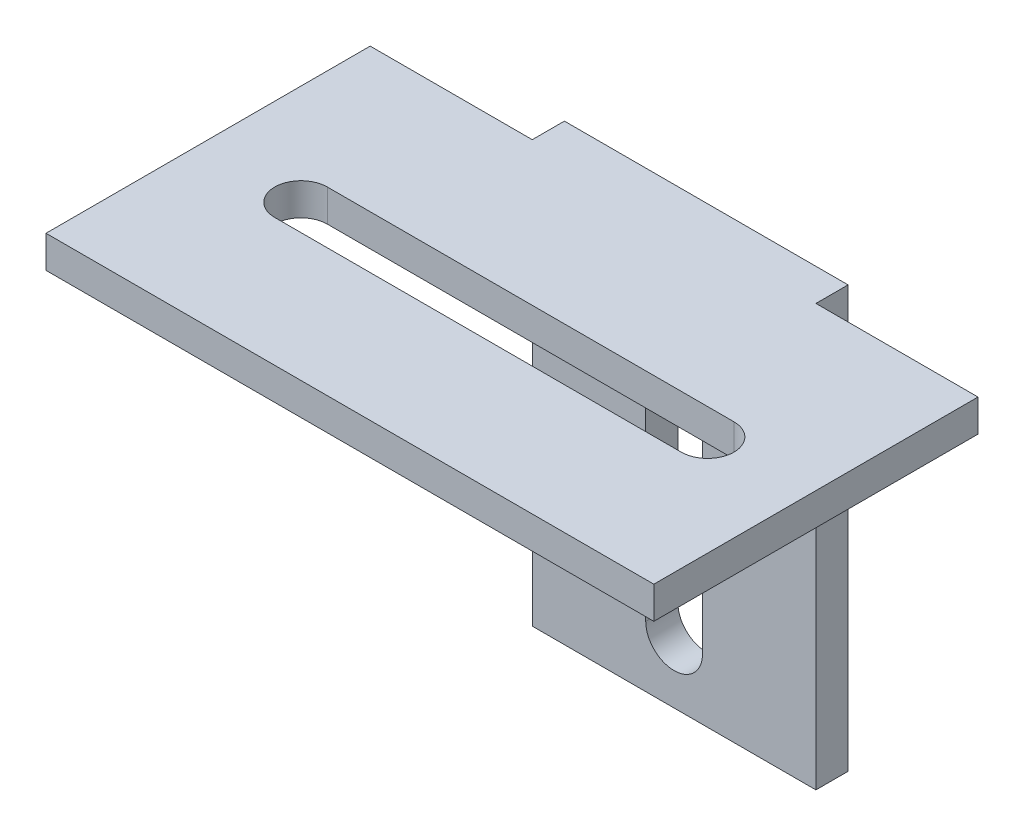
ISO-10303-21;
HEADER;
FILE_DESCRIPTION(('STEP AP214'),'2;1');
FILE_NAME('part.step','',(''),(''),'','','');
FILE_SCHEMA(('AUTOMOTIVE_DESIGN { 1 0 10303 214 1 1 1 1 }'));
ENDSEC;
DATA;
#1=APPLICATION_CONTEXT('core data for automotive mechanical design processes');
#2=APPLICATION_PROTOCOL_DEFINITION('international standard','automotive_design',2000,#1);
#3=PRODUCT_CONTEXT('',#1,'mechanical');
#4=PRODUCT('Part','Part','',(#3));
#5=PRODUCT_RELATED_PRODUCT_CATEGORY('part','',(#4));
#6=PRODUCT_DEFINITION_FORMATION('','',#4);
#7=PRODUCT_DEFINITION_CONTEXT('part definition',#1,'design');
#8=PRODUCT_DEFINITION('design','',#6,#7);
#9=PRODUCT_DEFINITION_SHAPE('','',#8);
#10=(LENGTH_UNIT() NAMED_UNIT(*) SI_UNIT(.MILLI.,.METRE.));
#11=(NAMED_UNIT(*) PLANE_ANGLE_UNIT() SI_UNIT($,.RADIAN.));
#12=(NAMED_UNIT(*) SI_UNIT($,.STERADIAN.) SOLID_ANGLE_UNIT());
#13=UNCERTAINTY_MEASURE_WITH_UNIT(LENGTH_MEASURE(1.E-05),#10,'distance_accuracy_value','');
#14=(GEOMETRIC_REPRESENTATION_CONTEXT(3) GLOBAL_UNCERTAINTY_ASSIGNED_CONTEXT((#13)) GLOBAL_UNIT_ASSIGNED_CONTEXT((#10,
#11,#12)) REPRESENTATION_CONTEXT('',''));
#15=CARTESIAN_POINT('',(0.,0.,0.));
#16=DIRECTION('',(0.,0.,1.));
#17=DIRECTION('',(1.,0.,0.));
#18=AXIS2_PLACEMENT_3D('',#15,#16,#17);
#19=CARTESIAN_POINT('',(0.,104.,24.1375));
#20=DIRECTION('',(0.,0.,1.));
#21=DIRECTION('',(1.,0.,0.));
#22=AXIS2_PLACEMENT_3D('',#19,#20,#21);
#23=PLANE('',#22);
#24=DIRECTION('',(0.,-1.,0.));
#25=VECTOR('',#24,1.);
#26=CARTESIAN_POINT('',(35.,0.,24.1375));
#27=LINE('',#26,#25);
#28=CARTESIAN_POINT('',(35.,7.93750000000002,24.1375));
#29=VERTEX_POINT('',#28);
#30=CARTESIAN_POINT('',(35.,0.,24.1375));
#31=VERTEX_POINT('',#30);
#32=EDGE_CURVE('E65',#29,#31,#27,.T.);
#33=ORIENTED_EDGE('',*,*,#32,.F.);
#34=DIRECTION('',(1.,0.,0.));
#35=VECTOR('',#34,1.);
#36=CARTESIAN_POINT('',(0.,7.93750000000001,24.1375));
#37=LINE('',#36,#35);
#38=CARTESIAN_POINT('',(75.,7.93750000000003,24.1375));
#39=VERTEX_POINT('',#38);
#40=EDGE_CURVE('E51',#29,#39,#37,.T.);
#41=ORIENTED_EDGE('',*,*,#40,.T.);
#42=DIRECTION('',(0.,-1.,0.));
#43=VECTOR('',#42,1.);
#44=CARTESIAN_POINT('',(75.,0.,24.1375));
#45=LINE('',#44,#43);
#46=CARTESIAN_POINT('',(75.,0.,24.1375));
#47=VERTEX_POINT('',#46);
#48=EDGE_CURVE('E237',#39,#47,#45,.T.);
#49=ORIENTED_EDGE('',*,*,#48,.T.);
#50=DIRECTION('',(1.,0.,0.));
#51=VECTOR('',#50,1.);
#52=CARTESIAN_POINT('',(0.,0.,24.1375));
#53=LINE('',#52,#51);
#54=EDGE_CURVE('E240',#31,#47,#53,.T.);
#55=ORIENTED_EDGE('',*,*,#54,.F.);
#56=EDGE_LOOP('',(#33,#41,#49,#55));
#57=FACE_BOUND('',#56,.T.);
#58=ADVANCED_FACE('F43',(#57),#23,.F.);
#59=CARTESIAN_POINT('',(-50.168497939826,0.,72.5375));
#60=DIRECTION('',(0.,0.,-1.));
#61=DIRECTION('',(-1.,0.,0.));
#62=AXIS2_PLACEMENT_3D('',#59,#60,#61);
#63=PLANE('',#62);
#64=DIRECTION('',(0.,-1.,0.));
#65=VECTOR('',#64,1.);
#66=CARTESIAN_POINT('',(-50.168497939826,0.,72.5375));
#67=LINE('',#66,#65);
#68=CARTESIAN_POINT('',(-50.168497939826,7.93750000000001,72.5375));
#69=VERTEX_POINT('',#68);
#70=CARTESIAN_POINT('',(-50.168497939826,0.,72.5375));
#71=VERTEX_POINT('',#70);
#72=EDGE_CURVE('E295',#69,#71,#67,.T.);
#73=ORIENTED_EDGE('',*,*,#72,.F.);
#74=DIRECTION('',(-1.,0.,0.));
#75=VECTOR('',#74,1.);
#76=CARTESIAN_POINT('',(0.,7.93750000000001,72.5375));
#77=LINE('',#76,#75);
#78=CARTESIAN_POINT('',(50.168497939826,7.93750000000002,72.5375));
#79=VERTEX_POINT('',#78);
#80=EDGE_CURVE('E282',#79,#69,#77,.T.);
#81=ORIENTED_EDGE('',*,*,#80,.F.);
#82=DIRECTION('',(0.,-1.,0.));
#83=VECTOR('',#82,1.);
#84=CARTESIAN_POINT('',(50.168497939826,0.,72.5375));
#85=LINE('',#84,#83);
#86=CARTESIAN_POINT('',(50.168497939826,0.,72.5375));
#87=VERTEX_POINT('',#86);
#88=EDGE_CURVE('E293',#79,#87,#85,.T.);
#89=ORIENTED_EDGE('',*,*,#88,.T.);
#90=DIRECTION('',(-1.,0.,0.));
#91=VECTOR('',#90,1.);
#92=CARTESIAN_POINT('',(-50.168497939826,0.,72.5375));
#93=LINE('',#92,#91);
#94=EDGE_CURVE('E261',#87,#71,#93,.T.);
#95=ORIENTED_EDGE('',*,*,#94,.T.);
#96=EDGE_LOOP('',(#73,#81,#89,#95));
#97=FACE_BOUND('',#96,.T.);
#98=ADVANCED_FACE('F309',(#97),#63,.T.);
#99=CARTESIAN_POINT('',(50.168497939826,0.,66.0375));
#100=DIRECTION('',(0.,-1.,0.));
#101=DIRECTION('',(1.,0.,0.));
#102=AXIS2_PLACEMENT_3D('',#99,#100,#101);
#103=CYLINDRICAL_SURFACE('',#102,6.49999999999999);
#104=ORIENTED_EDGE('',*,*,#88,.F.);
#105=CARTESIAN_POINT('',(50.168497939826,7.93750000000001,66.0375));
#106=DIRECTION('',(0.,-1.,0.));
#107=DIRECTION('',(1.,0.,0.));
#108=AXIS2_PLACEMENT_3D('',#105,#106,#107);
#109=CIRCLE('',#108,6.49999999999999);
#110=CARTESIAN_POINT('',(50.168497939826,7.93750000000002,59.5375));
#111=VERTEX_POINT('',#110);
#112=EDGE_CURVE('E249',#111,#79,#109,.T.);
#113=ORIENTED_EDGE('',*,*,#112,.F.);
#114=DIRECTION('',(0.,-1.,0.));
#115=VECTOR('',#114,1.);
#116=CARTESIAN_POINT('',(50.168497939826,0.,59.5375));
#117=LINE('',#116,#115);
#118=CARTESIAN_POINT('',(50.168497939826,0.,59.5375));
#119=VERTEX_POINT('',#118);
#120=EDGE_CURVE('E291',#111,#119,#117,.T.);
#121=ORIENTED_EDGE('',*,*,#120,.T.);
#122=CARTESIAN_POINT('',(50.168497939826,0.,66.0375));
#123=DIRECTION('',(0.,-1.,0.));
#124=DIRECTION('',(1.,0.,0.));
#125=AXIS2_PLACEMENT_3D('',#122,#123,#124);
#126=CIRCLE('',#125,6.49999999999999);
#127=EDGE_CURVE('E264',#119,#87,#126,.T.);
#128=ORIENTED_EDGE('',*,*,#127,.T.);
#129=EDGE_LOOP('',(#104,#113,#121,#128));
#130=FACE_BOUND('',#129,.T.);
#131=ADVANCED_FACE('F314',(#130),#103,.F.);
#132=CARTESIAN_POINT('',(-50.168497939826,0.,59.5375));
#133=DIRECTION('',(0.,0.,1.));
#134=DIRECTION('',(1.,0.,0.));
#135=AXIS2_PLACEMENT_3D('',#132,#133,#134);
#136=PLANE('',#135);
#137=ORIENTED_EDGE('',*,*,#120,.F.);
#138=DIRECTION('',(-1.,0.,0.));
#139=VECTOR('',#138,1.);
#140=CARTESIAN_POINT('',(0.,7.93750000000001,59.5375));
#141=LINE('',#140,#139);
#142=CARTESIAN_POINT('',(-50.168497939826,7.93750000000001,59.5375));
#143=VERTEX_POINT('',#142);
#144=EDGE_CURVE('E271',#143,#111,#141,.F.);
#145=ORIENTED_EDGE('',*,*,#144,.F.);
#146=DIRECTION('',(0.,-1.,0.));
#147=VECTOR('',#146,1.);
#148=CARTESIAN_POINT('',(-50.168497939826,0.,59.5375));
#149=LINE('',#148,#147);
#150=CARTESIAN_POINT('',(-50.168497939826,0.,59.5375));
#151=VERTEX_POINT('',#150);
#152=EDGE_CURVE('E290',#143,#151,#149,.T.);
#153=ORIENTED_EDGE('',*,*,#152,.T.);
#154=DIRECTION('',(1.,0.,0.));
#155=VECTOR('',#154,1.);
#156=CARTESIAN_POINT('',(-50.168497939826,0.,59.5375));
#157=LINE('',#156,#155);
#158=EDGE_CURVE('E255',#151,#119,#157,.T.);
#159=ORIENTED_EDGE('',*,*,#158,.T.);
#160=EDGE_LOOP('',(#137,#145,#153,#159));
#161=FACE_BOUND('',#160,.T.);
#162=ADVANCED_FACE('F299',(#161),#136,.T.);
#163=CARTESIAN_POINT('',(75.,0.,7.9375));
#164=DIRECTION('',(1.,0.,0.));
#165=DIRECTION('',(0.,0.,-1.));
#166=AXIS2_PLACEMENT_3D('',#163,#164,#165);
#167=PLANE('',#166);
#168=ORIENTED_EDGE('',*,*,#48,.F.);
#169=DIRECTION('',(0.,0.,1.));
#170=VECTOR('',#169,1.);
#171=CARTESIAN_POINT('',(75.,7.93750000000003,7.9375));
#172=LINE('',#171,#170);
#173=CARTESIAN_POINT('',(75.,7.93750000000003,104.1375));
#174=VERTEX_POINT('',#173);
#175=EDGE_CURVE('E243',#174,#39,#172,.F.);
#176=ORIENTED_EDGE('',*,*,#175,.F.);
#177=DIRECTION('',(0.,-1.,0.));
#178=VECTOR('',#177,1.);
#179=CARTESIAN_POINT('',(75.,0.,104.1375));
#180=LINE('',#179,#178);
#181=CARTESIAN_POINT('',(75.,0.,104.1375));
#182=VERTEX_POINT('',#181);
#183=EDGE_CURVE('E288',#174,#182,#180,.T.);
#184=ORIENTED_EDGE('',*,*,#183,.T.);
#185=DIRECTION('',(0.,0.,-1.));
#186=VECTOR('',#185,1.);
#187=CARTESIAN_POINT('',(75.,0.,7.9375));
#188=LINE('',#187,#186);
#189=EDGE_CURVE('E245',#182,#47,#188,.T.);
#190=ORIENTED_EDGE('',*,*,#189,.T.);
#191=EDGE_LOOP('',(#168,#176,#184,#190));
#192=FACE_BOUND('',#191,.T.);
#193=ADVANCED_FACE('F321',(#192),#167,.T.);
#194=CARTESIAN_POINT('',(-75.,0.,104.1375));
#195=DIRECTION('',(0.,0.,-1.));
#196=DIRECTION('',(-1.,0.,0.));
#197=AXIS2_PLACEMENT_3D('',#194,#195,#196);
#198=PLANE('',#197);
#199=ORIENTED_EDGE('',*,*,#183,.F.);
#200=DIRECTION('',(-1.,0.,0.));
#201=VECTOR('',#200,1.);
#202=CARTESIAN_POINT('',(0.,7.93750000000001,104.1375));
#203=LINE('',#202,#201);
#204=CARTESIAN_POINT('',(-75.,7.9375,104.1375));
#205=VERTEX_POINT('',#204);
#206=EDGE_CURVE('E272',#174,#205,#203,.T.);
#207=ORIENTED_EDGE('',*,*,#206,.T.);
#208=DIRECTION('',(0.,-1.,0.));
#209=VECTOR('',#208,1.);
#210=CARTESIAN_POINT('',(-75.,0.,104.1375));
#211=LINE('',#210,#209);
#212=CARTESIAN_POINT('',(-75.,0.,104.1375));
#213=VERTEX_POINT('',#212);
#214=EDGE_CURVE('E267',#205,#213,#211,.T.);
#215=ORIENTED_EDGE('',*,*,#214,.T.);
#216=DIRECTION('',(-1.,0.,0.));
#217=VECTOR('',#216,1.);
#218=CARTESIAN_POINT('',(-75.,0.,104.1375));
#219=LINE('',#218,#217);
#220=EDGE_CURVE('E248',#182,#213,#219,.T.);
#221=ORIENTED_EDGE('',*,*,#220,.F.);
#222=EDGE_LOOP('',(#199,#207,#215,#221));
#223=FACE_BOUND('',#222,.T.);
#224=ADVANCED_FACE('F364',(#223),#198,.F.);
#225=CARTESIAN_POINT('',(-75.,0.,7.9375));
#226=DIRECTION('',(1.,0.,0.));
#227=DIRECTION('',(0.,0.,-1.));
#228=AXIS2_PLACEMENT_3D('',#225,#226,#227);
#229=PLANE('',#228);
#230=DIRECTION('',(0.,-1.,0.));
#231=VECTOR('',#230,1.);
#232=CARTESIAN_POINT('',(-75.,0.,24.1375));
#233=LINE('',#232,#231);
#234=CARTESIAN_POINT('',(-75.,0.,24.1375));
#235=VERTEX_POINT('',#234);
#236=CARTESIAN_POINT('',(-75.,7.9375,24.1375));
#237=VERTEX_POINT('',#236);
#238=EDGE_CURVE('E231',#235,#237,#233,.F.);
#239=ORIENTED_EDGE('',*,*,#238,.F.);
#240=DIRECTION('',(0.,0.,-1.));
#241=VECTOR('',#240,1.);
#242=CARTESIAN_POINT('',(-75.,0.,7.9375));
#243=LINE('',#242,#241);
#244=EDGE_CURVE('E252',#213,#235,#243,.T.);
#245=ORIENTED_EDGE('',*,*,#244,.F.);
#246=ORIENTED_EDGE('',*,*,#214,.F.);
#247=DIRECTION('',(0.,0.,1.));
#248=VECTOR('',#247,1.);
#249=CARTESIAN_POINT('',(-75.,7.9375,7.9375));
#250=LINE('',#249,#248);
#251=EDGE_CURVE('E268',#205,#237,#250,.F.);
#252=ORIENTED_EDGE('',*,*,#251,.T.);
#253=EDGE_LOOP('',(#239,#245,#246,#252));
#254=FACE_BOUND('',#253,.T.);
#255=ADVANCED_FACE('F366',(#254),#229,.F.);
#256=CARTESIAN_POINT('',(-50.168497939826,0.,66.0375));
#257=DIRECTION('',(0.,-1.,0.));
#258=DIRECTION('',(1.,0.,0.));
#259=AXIS2_PLACEMENT_3D('',#256,#257,#258);
#260=CYLINDRICAL_SURFACE('',#259,6.49999999999999);
#261=CARTESIAN_POINT('',(-50.168497939826,7.93749999999999,66.0375));
#262=DIRECTION('',(0.,-1.,0.));
#263=DIRECTION('',(1.,0.,0.));
#264=AXIS2_PLACEMENT_3D('',#261,#262,#263);
#265=CIRCLE('',#264,6.49999999999999);
#266=EDGE_CURVE('E279',#69,#143,#265,.T.);
#267=ORIENTED_EDGE('',*,*,#266,.F.);
#268=ORIENTED_EDGE('',*,*,#72,.T.);
#269=CARTESIAN_POINT('',(-50.168497939826,0.,66.0375));
#270=DIRECTION('',(0.,-1.,0.));
#271=DIRECTION('',(1.,0.,0.));
#272=AXIS2_PLACEMENT_3D('',#269,#270,#271);
#273=CIRCLE('',#272,6.49999999999999);
#274=EDGE_CURVE('E258',#71,#151,#273,.T.);
#275=ORIENTED_EDGE('',*,*,#274,.T.);
#276=ORIENTED_EDGE('',*,*,#152,.F.);
#277=EDGE_LOOP('',(#267,#268,#275,#276));
#278=FACE_BOUND('',#277,.T.);
#279=ADVANCED_FACE('F45',(#278),#260,.F.);
#280=CARTESIAN_POINT('',(0.,0.,7.9375));
#281=DIRECTION('',(0.,1.,0.));
#282=DIRECTION('',(-1.,0.,0.));
#283=AXIS2_PLACEMENT_3D('',#280,#281,#282);
#284=PLANE('',#283);
#285=ORIENTED_EDGE('',*,*,#244,.T.);
#286=CARTESIAN_POINT('',(-35.,0.,24.1375));
#287=VERTEX_POINT('',#286);
#288=EDGE_CURVE('E241',#235,#287,#53,.T.);
#289=ORIENTED_EDGE('',*,*,#288,.T.);
#290=EDGE_CURVE('E244',#287,#31,#53,.T.);
#291=ORIENTED_EDGE('',*,*,#290,.T.);
#292=ORIENTED_EDGE('',*,*,#54,.T.);
#293=ORIENTED_EDGE('',*,*,#189,.F.);
#294=ORIENTED_EDGE('',*,*,#220,.T.);
#295=EDGE_LOOP('',(#285,#289,#291,#292,#293,#294));
#296=FACE_BOUND('',#295,.T.);
#297=ORIENTED_EDGE('',*,*,#158,.F.);
#298=ORIENTED_EDGE('',*,*,#274,.F.);
#299=ORIENTED_EDGE('',*,*,#94,.F.);
#300=ORIENTED_EDGE('',*,*,#127,.F.);
#301=EDGE_LOOP('',(#297,#298,#299,#300));
#302=FACE_BOUND('',#301,.T.);
#303=ADVANCED_FACE('F305',(#296,#302),#284,.F.);
#304=CARTESIAN_POINT('',(0.,7.93750000000001,7.9375));
#305=DIRECTION('',(0.,1.,0.));
#306=DIRECTION('',(-1.,0.,0.));
#307=AXIS2_PLACEMENT_3D('',#304,#305,#306);
#308=PLANE('',#307);
#309=CARTESIAN_POINT('',(-35.,7.93750000000001,24.1375));
#310=VERTEX_POINT('',#309);
#311=EDGE_CURVE('E11',#237,#310,#37,.T.);
#312=ORIENTED_EDGE('',*,*,#311,.F.);
#313=ORIENTED_EDGE('',*,*,#251,.F.);
#314=ORIENTED_EDGE('',*,*,#206,.F.);
#315=ORIENTED_EDGE('',*,*,#175,.T.);
#316=ORIENTED_EDGE('',*,*,#40,.F.);
#317=DIRECTION('',(0.,0.,1.));
#318=VECTOR('',#317,1.);
#319=CARTESIAN_POINT('',(35.,7.93750000000002,16.2));
#320=LINE('',#319,#318);
#321=CARTESIAN_POINT('',(35.,7.93750000000002,16.2));
#322=VERTEX_POINT('',#321);
#323=EDGE_CURVE('E225',#322,#29,#320,.T.);
#324=ORIENTED_EDGE('',*,*,#323,.F.);
#325=DIRECTION('',(1.,0.,0.));
#326=VECTOR('',#325,1.);
#327=CARTESIAN_POINT('',(0.,7.93750000000001,16.2));
#328=LINE('',#327,#326);
#329=CARTESIAN_POINT('',(-35.,7.93750000000001,16.2));
#330=VERTEX_POINT('',#329);
#331=EDGE_CURVE('E196',#330,#322,#328,.T.);
#332=ORIENTED_EDGE('',*,*,#331,.F.);
#333=DIRECTION('',(0.,0.,1.));
#334=VECTOR('',#333,1.);
#335=CARTESIAN_POINT('',(-35.,7.93750000000001,16.2));
#336=LINE('',#335,#334);
#337=EDGE_CURVE('E228',#330,#310,#336,.T.);
#338=ORIENTED_EDGE('',*,*,#337,.T.);
#339=EDGE_LOOP('',(#312,#313,#314,#315,#316,#324,#332,#338));
#340=FACE_BOUND('',#339,.T.);
#341=ORIENTED_EDGE('',*,*,#144,.T.);
#342=ORIENTED_EDGE('',*,*,#112,.T.);
#343=ORIENTED_EDGE('',*,*,#80,.T.);
#344=ORIENTED_EDGE('',*,*,#266,.T.);
#345=EDGE_LOOP('',(#341,#342,#343,#344));
#346=FACE_BOUND('',#345,.T.);
#347=ADVANCED_FACE('F311',(#340,#346),#308,.T.);
#348=ORIENTED_EDGE('',*,*,#311,.T.);
#349=DIRECTION('',(0.,-1.,0.));
#350=VECTOR('',#349,1.);
#351=CARTESIAN_POINT('',(-35.,0.,24.1375));
#352=LINE('',#351,#350);
#353=EDGE_CURVE('E57',#310,#287,#352,.T.);
#354=ORIENTED_EDGE('',*,*,#353,.T.);
#355=ORIENTED_EDGE('',*,*,#288,.F.);
#356=ORIENTED_EDGE('',*,*,#238,.T.);
#357=EDGE_LOOP('',(#348,#354,#355,#356));
#358=FACE_BOUND('',#357,.T.);
#359=ADVANCED_FACE('F325',(#358),#23,.F.);
#360=CARTESIAN_POINT('',(-35.,0.,16.2));
#361=DIRECTION('',(-1.,0.,0.));
#362=DIRECTION('',(0.,-1.,0.));
#363=AXIS2_PLACEMENT_3D('',#360,#361,#362);
#364=PLANE('',#363);
#365=ORIENTED_EDGE('',*,*,#353,.F.);
#366=ORIENTED_EDGE('',*,*,#337,.F.);
#367=DIRECTION('',(0.,-1.,0.));
#368=VECTOR('',#367,1.);
#369=CARTESIAN_POINT('',(-35.,0.,16.2));
#370=LINE('',#369,#368);
#371=CARTESIAN_POINT('',(-35.,-96.03125,16.2));
#372=VERTEX_POINT('',#371);
#373=EDGE_CURVE('E193',#330,#372,#370,.T.);
#374=ORIENTED_EDGE('',*,*,#373,.T.);
#375=DIRECTION('',(0.,0.,1.));
#376=VECTOR('',#375,1.);
#377=CARTESIAN_POINT('',(-35.,-96.03125,16.2));
#378=LINE('',#377,#376);
#379=CARTESIAN_POINT('',(-35.,-96.03125,24.1375));
#380=VERTEX_POINT('',#379);
#381=EDGE_CURVE('E172',#372,#380,#378,.T.);
#382=ORIENTED_EDGE('',*,*,#381,.T.);
#383=EDGE_CURVE('E214',#287,#380,#352,.T.);
#384=ORIENTED_EDGE('',*,*,#383,.F.);
#385=EDGE_LOOP('',(#365,#366,#374,#382,#384));
#386=FACE_BOUND('',#385,.T.);
#387=ADVANCED_FACE('F333',(#386),#364,.T.);
#388=CARTESIAN_POINT('',(35.,0.,16.2));
#389=DIRECTION('',(-1.,0.,0.));
#390=DIRECTION('',(0.,-1.,0.));
#391=AXIS2_PLACEMENT_3D('',#388,#389,#390);
#392=PLANE('',#391);
#393=ORIENTED_EDGE('',*,*,#32,.T.);
#394=CARTESIAN_POINT('',(35.,-96.03125,24.1375));
#395=VERTEX_POINT('',#394);
#396=EDGE_CURVE('E216',#31,#395,#27,.T.);
#397=ORIENTED_EDGE('',*,*,#396,.T.);
#398=DIRECTION('',(0.,0.,1.));
#399=VECTOR('',#398,1.);
#400=CARTESIAN_POINT('',(35.,-96.03125,16.2));
#401=LINE('',#400,#399);
#402=CARTESIAN_POINT('',(35.,-96.03125,16.2));
#403=VERTEX_POINT('',#402);
#404=EDGE_CURVE('E222',#403,#395,#401,.T.);
#405=ORIENTED_EDGE('',*,*,#404,.F.);
#406=DIRECTION('',(0.,-1.,0.));
#407=VECTOR('',#406,1.);
#408=CARTESIAN_POINT('',(35.,0.,16.2));
#409=LINE('',#408,#407);
#410=EDGE_CURVE('E199',#322,#403,#409,.T.);
#411=ORIENTED_EDGE('',*,*,#410,.F.);
#412=ORIENTED_EDGE('',*,*,#323,.T.);
#413=EDGE_LOOP('',(#393,#397,#405,#411,#412));
#414=FACE_BOUND('',#413,.T.);
#415=ADVANCED_FACE('F337',(#414),#392,.F.);
#416=CARTESIAN_POINT('',(0.,-81.03125,16.2));
#417=DIRECTION('',(0.,0.,1.));
#418=DIRECTION('',(1.,0.,0.));
#419=AXIS2_PLACEMENT_3D('',#416,#417,#418);
#420=CYLINDRICAL_SURFACE('',#419,7.);
#421=CARTESIAN_POINT('',(0.,-81.03125,24.1375));
#422=DIRECTION('',(0.,0.,-1.));
#423=DIRECTION('',(-1.,0.,0.));
#424=AXIS2_PLACEMENT_3D('',#421,#422,#423);
#425=CIRCLE('',#424,7.);
#426=CARTESIAN_POINT('',(6.99999999999999,-81.03125,24.1375));
#427=VERTEX_POINT('',#426);
#428=CARTESIAN_POINT('',(-7.00000000000001,-81.03125,24.1375));
#429=VERTEX_POINT('',#428);
#430=EDGE_CURVE('E167',#427,#429,#425,.T.);
#431=ORIENTED_EDGE('',*,*,#430,.F.);
#432=DIRECTION('',(0.,0.,1.));
#433=VECTOR('',#432,1.);
#434=CARTESIAN_POINT('',(6.99999999999999,-81.03125,16.2));
#435=LINE('',#434,#433);
#436=CARTESIAN_POINT('',(6.99999999999999,-81.03125,16.2));
#437=VERTEX_POINT('',#436);
#438=EDGE_CURVE('E162',#437,#427,#435,.T.);
#439=ORIENTED_EDGE('',*,*,#438,.F.);
#440=CARTESIAN_POINT('',(0.,-81.03125,16.2));
#441=DIRECTION('',(0.,0.,-1.));
#442=DIRECTION('',(-1.,0.,0.));
#443=AXIS2_PLACEMENT_3D('',#440,#441,#442);
#444=CIRCLE('',#443,7.);
#445=CARTESIAN_POINT('',(-7.00000000000001,-81.03125,16.2));
#446=VERTEX_POINT('',#445);
#447=EDGE_CURVE('E165',#437,#446,#444,.T.);
#448=ORIENTED_EDGE('',*,*,#447,.T.);
#449=DIRECTION('',(0.,0.,1.));
#450=VECTOR('',#449,1.);
#451=CARTESIAN_POINT('',(-7.00000000000001,-81.03125,16.2));
#452=LINE('',#451,#450);
#453=EDGE_CURVE('E204',#446,#429,#452,.T.);
#454=ORIENTED_EDGE('',*,*,#453,.T.);
#455=EDGE_LOOP('',(#431,#439,#448,#454));
#456=FACE_BOUND('',#455,.T.);
#457=ADVANCED_FACE('F164',(#456),#420,.F.);
#458=CARTESIAN_POINT('',(7.,0.,16.2));
#459=DIRECTION('',(-1.,0.,0.));
#460=DIRECTION('',(0.,-1.,0.));
#461=AXIS2_PLACEMENT_3D('',#458,#459,#460);
#462=PLANE('',#461);
#463=DIRECTION('',(0.,-1.,0.));
#464=VECTOR('',#463,1.);
#465=CARTESIAN_POINT('',(7.,0.,24.1375));
#466=LINE('',#465,#464);
#467=CARTESIAN_POINT('',(7.,-13.2407384522728,24.1375));
#468=VERTEX_POINT('',#467);
#469=EDGE_CURVE('E206',#468,#427,#466,.T.);
#470=ORIENTED_EDGE('',*,*,#469,.F.);
#471=DIRECTION('',(0.,0.,1.));
#472=VECTOR('',#471,1.);
#473=CARTESIAN_POINT('',(7.,-13.2407384522728,16.2));
#474=LINE('',#473,#472);
#475=CARTESIAN_POINT('',(7.,-13.2407384522728,16.2));
#476=VERTEX_POINT('',#475);
#477=EDGE_CURVE('E173',#476,#468,#474,.T.);
#478=ORIENTED_EDGE('',*,*,#477,.F.);
#479=DIRECTION('',(0.,-1.,0.));
#480=VECTOR('',#479,1.);
#481=CARTESIAN_POINT('',(7.,0.,16.2));
#482=LINE('',#481,#480);
#483=EDGE_CURVE('E180',#476,#437,#482,.T.);
#484=ORIENTED_EDGE('',*,*,#483,.T.);
#485=ORIENTED_EDGE('',*,*,#438,.T.);
#486=EDGE_LOOP('',(#470,#478,#484,#485));
#487=FACE_BOUND('',#486,.T.);
#488=ADVANCED_FACE('F187',(#487),#462,.T.);
#489=CARTESIAN_POINT('',(0.,-13.2407384522728,16.2));
#490=DIRECTION('',(0.,0.,1.));
#491=DIRECTION('',(1.,0.,0.));
#492=AXIS2_PLACEMENT_3D('',#489,#490,#491);
#493=CYLINDRICAL_SURFACE('',#492,7.);
#494=CARTESIAN_POINT('',(0.,-13.2407384522728,24.1375));
#495=DIRECTION('',(0.,0.,-1.));
#496=DIRECTION('',(-1.,0.,0.));
#497=AXIS2_PLACEMENT_3D('',#494,#495,#496);
#498=CIRCLE('',#497,7.);
#499=CARTESIAN_POINT('',(-7.,-13.2407384522728,24.1375));
#500=VERTEX_POINT('',#499);
#501=EDGE_CURVE('E208',#500,#468,#498,.T.);
#502=ORIENTED_EDGE('',*,*,#501,.F.);
#503=DIRECTION('',(0.,0.,1.));
#504=VECTOR('',#503,1.);
#505=CARTESIAN_POINT('',(-7.,-13.2407384522728,16.2));
#506=LINE('',#505,#504);
#507=CARTESIAN_POINT('',(-7.,-13.2407384522728,16.2));
#508=VERTEX_POINT('',#507);
#509=EDGE_CURVE('E233',#508,#500,#506,.T.);
#510=ORIENTED_EDGE('',*,*,#509,.F.);
#511=CARTESIAN_POINT('',(0.,-13.2407384522728,16.2));
#512=DIRECTION('',(0.,0.,-1.));
#513=DIRECTION('',(-1.,0.,0.));
#514=AXIS2_PLACEMENT_3D('',#511,#512,#513);
#515=CIRCLE('',#514,7.);
#516=EDGE_CURVE('E188',#508,#476,#515,.T.);
#517=ORIENTED_EDGE('',*,*,#516,.T.);
#518=ORIENTED_EDGE('',*,*,#477,.T.);
#519=EDGE_LOOP('',(#502,#510,#517,#518));
#520=FACE_BOUND('',#519,.T.);
#521=ADVANCED_FACE('F479',(#520),#493,.F.);
#522=CARTESIAN_POINT('',(-7.,0.,16.2));
#523=DIRECTION('',(-1.,0.,0.));
#524=DIRECTION('',(0.,-1.,0.));
#525=AXIS2_PLACEMENT_3D('',#522,#523,#524);
#526=PLANE('',#525);
#527=DIRECTION('',(0.,-1.,0.));
#528=VECTOR('',#527,1.);
#529=CARTESIAN_POINT('',(-7.,0.,24.1375));
#530=LINE('',#529,#528);
#531=EDGE_CURVE('E211',#500,#429,#530,.T.);
#532=ORIENTED_EDGE('',*,*,#531,.T.);
#533=ORIENTED_EDGE('',*,*,#453,.F.);
#534=DIRECTION('',(0.,-1.,0.));
#535=VECTOR('',#534,1.);
#536=CARTESIAN_POINT('',(-7.,0.,16.2));
#537=LINE('',#536,#535);
#538=EDGE_CURVE('E183',#508,#446,#537,.T.);
#539=ORIENTED_EDGE('',*,*,#538,.F.);
#540=ORIENTED_EDGE('',*,*,#509,.T.);
#541=EDGE_LOOP('',(#532,#533,#539,#540));
#542=FACE_BOUND('',#541,.T.);
#543=ADVANCED_FACE('F488',(#542),#526,.F.);
#544=CARTESIAN_POINT('',(0.,-96.03125,16.2));
#545=DIRECTION('',(0.,1.,0.));
#546=DIRECTION('',(0.,0.,1.));
#547=AXIS2_PLACEMENT_3D('',#544,#545,#546);
#548=PLANE('',#547);
#549=DIRECTION('',(-1.,0.,0.));
#550=VECTOR('',#549,1.);
#551=CARTESIAN_POINT('',(0.,-96.03125,24.1375));
#552=LINE('',#551,#550);
#553=EDGE_CURVE('E185',#395,#380,#552,.T.);
#554=ORIENTED_EDGE('',*,*,#553,.T.);
#555=ORIENTED_EDGE('',*,*,#381,.F.);
#556=DIRECTION('',(-1.,0.,0.));
#557=VECTOR('',#556,1.);
#558=CARTESIAN_POINT('',(0.,-96.03125,16.2));
#559=LINE('',#558,#557);
#560=EDGE_CURVE('E202',#403,#372,#559,.T.);
#561=ORIENTED_EDGE('',*,*,#560,.F.);
#562=ORIENTED_EDGE('',*,*,#404,.T.);
#563=EDGE_LOOP('',(#554,#555,#561,#562));
#564=FACE_BOUND('',#563,.T.);
#565=ADVANCED_FACE('F498',(#564),#548,.F.);
#566=CARTESIAN_POINT('',(0.,0.,16.2));
#567=DIRECTION('',(0.,0.,-1.));
#568=DIRECTION('',(-1.,0.,0.));
#569=AXIS2_PLACEMENT_3D('',#566,#567,#568);
#570=PLANE('',#569);
#571=ORIENTED_EDGE('',*,*,#447,.F.);
#572=ORIENTED_EDGE('',*,*,#483,.F.);
#573=ORIENTED_EDGE('',*,*,#516,.F.);
#574=ORIENTED_EDGE('',*,*,#538,.T.);
#575=EDGE_LOOP('',(#571,#572,#573,#574));
#576=FACE_BOUND('',#575,.T.);
#577=ORIENTED_EDGE('',*,*,#373,.F.);
#578=ORIENTED_EDGE('',*,*,#331,.T.);
#579=ORIENTED_EDGE('',*,*,#410,.T.);
#580=ORIENTED_EDGE('',*,*,#560,.T.);
#581=EDGE_LOOP('',(#577,#578,#579,#580));
#582=FACE_BOUND('',#581,.T.);
#583=ADVANCED_FACE('F177',(#576,#582),#570,.T.);
#584=CARTESIAN_POINT('',(0.,0.,24.1375));
#585=DIRECTION('',(0.,0.,-1.));
#586=DIRECTION('',(-1.,0.,0.));
#587=AXIS2_PLACEMENT_3D('',#584,#585,#586);
#588=PLANE('',#587);
#589=ORIENTED_EDGE('',*,*,#290,.F.);
#590=ORIENTED_EDGE('',*,*,#383,.T.);
#591=ORIENTED_EDGE('',*,*,#553,.F.);
#592=ORIENTED_EDGE('',*,*,#396,.F.);
#593=EDGE_LOOP('',(#589,#590,#591,#592));
#594=FACE_BOUND('',#593,.T.);
#595=ORIENTED_EDGE('',*,*,#430,.T.);
#596=ORIENTED_EDGE('',*,*,#531,.F.);
#597=ORIENTED_EDGE('',*,*,#501,.T.);
#598=ORIENTED_EDGE('',*,*,#469,.T.);
#599=EDGE_LOOP('',(#595,#596,#597,#598));
#600=FACE_BOUND('',#599,.T.);
#601=ADVANCED_FACE('F353',(#594,#600),#588,.F.);
#602=CLOSED_SHELL('',(#58,#98,#131,#162,#193,#224,#255,#279,#303,#347,#359,#387,#415,#457,#488,
#521,#543,#565,#583,#601));
#603=MANIFOLD_SOLID_BREP('B2',#602);
#604=ADVANCED_BREP_SHAPE_REPRESENTATION('',(#18,#603),#14);
#605=SHAPE_DEFINITION_REPRESENTATION(#9,#604);
ENDSEC;
END-ISO-10303-21;
